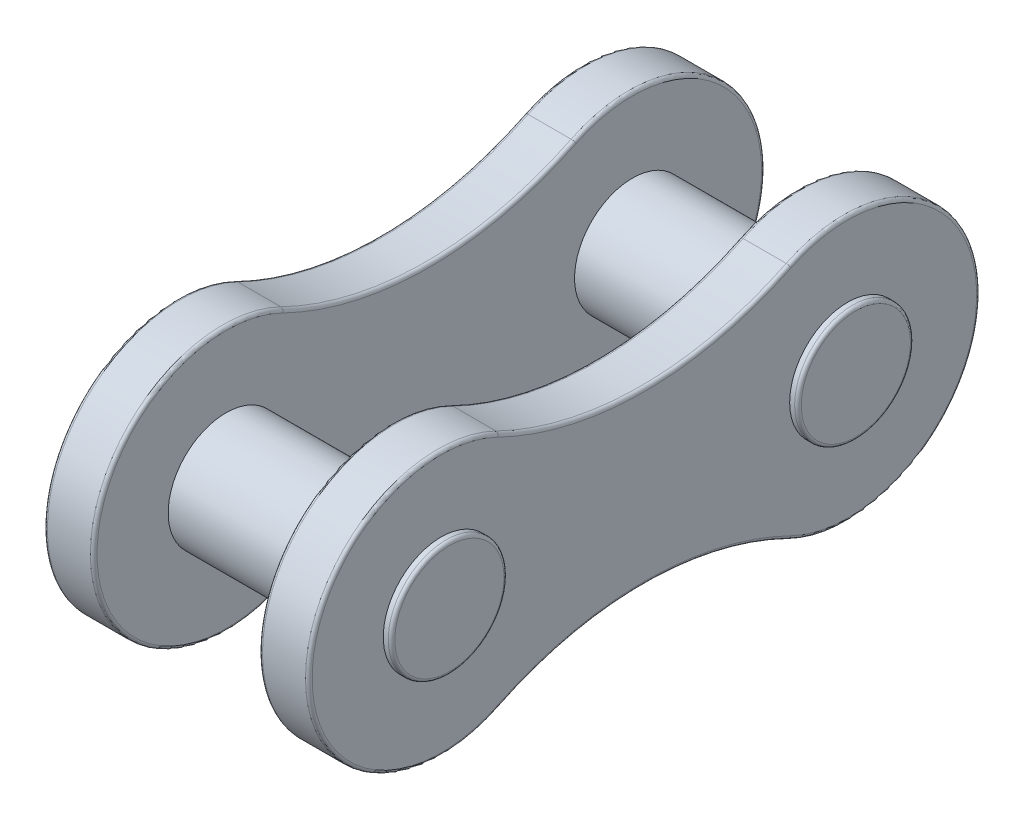
ISO-10303-21;
HEADER;
FILE_DESCRIPTION(('STEP AP214'),'2;1');
FILE_NAME('part.step','',(''),(''),'','','');
FILE_SCHEMA(('AUTOMOTIVE_DESIGN { 1 0 10303 214 1 1 1 1 }'));
ENDSEC;
DATA;
#1=APPLICATION_CONTEXT('core data for automotive mechanical design processes');
#2=APPLICATION_PROTOCOL_DEFINITION('international standard','automotive_design',2000,#1);
#3=PRODUCT_CONTEXT('',#1,'mechanical');
#4=PRODUCT('Part','Part','',(#3));
#5=PRODUCT_RELATED_PRODUCT_CATEGORY('part','',(#4));
#6=PRODUCT_DEFINITION_FORMATION('','',#4);
#7=PRODUCT_DEFINITION_CONTEXT('part definition',#1,'design');
#8=PRODUCT_DEFINITION('design','',#6,#7);
#9=PRODUCT_DEFINITION_SHAPE('','',#8);
#10=(LENGTH_UNIT() NAMED_UNIT(*) SI_UNIT(.MILLI.,.METRE.));
#11=(NAMED_UNIT(*) PLANE_ANGLE_UNIT() SI_UNIT($,.RADIAN.));
#12=(NAMED_UNIT(*) SI_UNIT($,.STERADIAN.) SOLID_ANGLE_UNIT());
#13=UNCERTAINTY_MEASURE_WITH_UNIT(LENGTH_MEASURE(1.E-05),#10,'distance_accuracy_value','');
#14=(GEOMETRIC_REPRESENTATION_CONTEXT(3) GLOBAL_UNCERTAINTY_ASSIGNED_CONTEXT((#13)) GLOBAL_UNIT_ASSIGNED_CONTEXT((#10,
#11,#12)) REPRESENTATION_CONTEXT('',''));
#15=CARTESIAN_POINT('',(0.,0.,0.));
#16=DIRECTION('',(0.,0.,1.));
#17=DIRECTION('',(1.,0.,0.));
#18=AXIS2_PLACEMENT_3D('',#15,#16,#17);
#19=CARTESIAN_POINT('',(4.,6.29072041592681,-3.07031539888683));
#20=DIRECTION('',(1.,0.,0.));
#21=DIRECTION('',(0.,0.,-1.));
#22=AXIS2_PLACEMENT_3D('',#19,#20,#21);
#23=PLANE('',#22);
#24=CARTESIAN_POINT('',(4.,-12.5814408318536,0.));
#25=DIRECTION('',(1.,0.,0.));
#26=DIRECTION('',(0.,0.,-1.));
#27=AXIS2_PLACEMENT_3D('',#24,#25,#26);
#28=CIRCLE('',#27,10.1);
#29=CARTESIAN_POINT('',(4.,-3.50482994601637,4.43002650410814));
#30=VERTEX_POINT('',#29);
#31=CARTESIAN_POINT('',(4.,-3.50482994601637,-4.43002650410814));
#32=VERTEX_POINT('',#31);
#33=EDGE_CURVE('E58',#30,#32,#28,.F.);
#34=ORIENTED_EDGE('',*,*,#33,.T.);
#35=CARTESIAN_POINT('',(4.,0.,-6.14063079777366));
#36=DIRECTION('',(1.,0.,0.));
#37=DIRECTION('',(0.,0.,-1.));
#38=AXIS2_PLACEMENT_3D('',#35,#36,#37);
#39=CIRCLE('',#38,3.9);
#40=CARTESIAN_POINT('',(4.,3.50482994601637,-4.43002650410814));
#41=VERTEX_POINT('',#40);
#42=EDGE_CURVE('E246',#32,#41,#39,.T.);
#43=ORIENTED_EDGE('',*,*,#42,.T.);
#44=CARTESIAN_POINT('',(4.,12.5814408318536,0.));
#45=DIRECTION('',(1.,0.,0.));
#46=DIRECTION('',(0.,0.,-1.));
#47=AXIS2_PLACEMENT_3D('',#44,#45,#46);
#48=CIRCLE('',#47,10.1);
#49=CARTESIAN_POINT('',(4.,3.50482994601637,4.43002650410814));
#50=VERTEX_POINT('',#49);
#51=EDGE_CURVE('E242',#41,#50,#48,.F.);
#52=ORIENTED_EDGE('',*,*,#51,.T.);
#53=CARTESIAN_POINT('',(4.,0.,6.14063079777366));
#54=DIRECTION('',(1.,0.,0.));
#55=DIRECTION('',(0.,0.,-1.));
#56=AXIS2_PLACEMENT_3D('',#53,#54,#55);
#57=CIRCLE('',#56,3.9);
#58=EDGE_CURVE('E63',#50,#30,#57,.T.);
#59=ORIENTED_EDGE('',*,*,#58,.T.);
#60=EDGE_LOOP('',(#34,#43,#52,#59));
#61=FACE_BOUND('',#60,.T.);
#62=CARTESIAN_POINT('',(4.,0.,6.14063079777366));
#63=DIRECTION('',(1.,0.,0.));
#64=DIRECTION('',(0.,0.,-1.));
#65=AXIS2_PLACEMENT_3D('',#62,#63,#64);
#66=CIRCLE('',#65,1.75);
#67=CARTESIAN_POINT('',(4.,0.,4.39063079777366));
#68=VERTEX_POINT('',#67);
#69=EDGE_CURVE('E342',#68,#68,#66,.T.);
#70=ORIENTED_EDGE('',*,*,#69,.F.);
#71=EDGE_LOOP('',(#70));
#72=FACE_BOUND('',#71,.T.);
#73=CARTESIAN_POINT('',(4.,0.,-6.14063079777366));
#74=DIRECTION('',(1.,0.,0.));
#75=DIRECTION('',(0.,0.,1.));
#76=AXIS2_PLACEMENT_3D('',#73,#74,#75);
#77=CIRCLE('',#76,1.75);
#78=CARTESIAN_POINT('',(4.,0.,-4.39063079777366));
#79=VERTEX_POINT('',#78);
#80=EDGE_CURVE('E345',#79,#79,#77,.T.);
#81=ORIENTED_EDGE('',*,*,#80,.F.);
#82=EDGE_LOOP('',(#81));
#83=FACE_BOUND('',#82,.T.);
#84=ADVANCED_FACE('F41',(#61,#72,#83),#23,.T.);
#85=CARTESIAN_POINT('',(2.5,6.29072041592681,-3.07031539888683));
#86=DIRECTION('',(1.,0.,0.));
#87=DIRECTION('',(0.,0.,-1.));
#88=AXIS2_PLACEMENT_3D('',#85,#86,#87);
#89=PLANE('',#88);
#90=CARTESIAN_POINT('',(2.5,12.5814408318536,0.));
#91=DIRECTION('',(1.,0.,0.));
#92=DIRECTION('',(0.,0.,-1.));
#93=AXIS2_PLACEMENT_3D('',#90,#91,#92);
#94=CIRCLE('',#93,10.1);
#95=CARTESIAN_POINT('',(2.5,3.50482994601637,4.43002650410814));
#96=VERTEX_POINT('',#95);
#97=CARTESIAN_POINT('',(2.5,3.50482994601637,-4.43002650410814));
#98=VERTEX_POINT('',#97);
#99=EDGE_CURVE('E225',#96,#98,#94,.T.);
#100=ORIENTED_EDGE('',*,*,#99,.T.);
#101=CARTESIAN_POINT('',(2.5,0.,-6.14063079777366));
#102=DIRECTION('',(1.,0.,0.));
#103=DIRECTION('',(0.,0.,-1.));
#104=AXIS2_PLACEMENT_3D('',#101,#102,#103);
#105=CIRCLE('',#104,3.9);
#106=CARTESIAN_POINT('',(2.5,-3.50482994601637,-4.43002650410814));
#107=VERTEX_POINT('',#106);
#108=EDGE_CURVE('E231',#98,#107,#105,.F.);
#109=ORIENTED_EDGE('',*,*,#108,.T.);
#110=CARTESIAN_POINT('',(2.5,-12.5814408318536,0.));
#111=DIRECTION('',(1.,0.,0.));
#112=DIRECTION('',(0.,0.,-1.));
#113=AXIS2_PLACEMENT_3D('',#110,#111,#112);
#114=CIRCLE('',#113,10.1);
#115=CARTESIAN_POINT('',(2.5,-3.50482994601637,4.43002650410814));
#116=VERTEX_POINT('',#115);
#117=EDGE_CURVE('E229',#107,#116,#114,.T.);
#118=ORIENTED_EDGE('',*,*,#117,.T.);
#119=CARTESIAN_POINT('',(2.5,0.,6.14063079777366));
#120=DIRECTION('',(1.,0.,0.));
#121=DIRECTION('',(0.,0.,-1.));
#122=AXIS2_PLACEMENT_3D('',#119,#120,#121);
#123=CIRCLE('',#122,3.9);
#124=EDGE_CURVE('E227',#116,#96,#123,.F.);
#125=ORIENTED_EDGE('',*,*,#124,.T.);
#126=EDGE_LOOP('',(#100,#109,#118,#125));
#127=FACE_BOUND('',#126,.T.);
#128=CARTESIAN_POINT('',(2.5,0.,6.14063079777366));
#129=DIRECTION('',(1.,0.,0.));
#130=DIRECTION('',(0.,0.,-1.));
#131=AXIS2_PLACEMENT_3D('',#128,#129,#130);
#132=CIRCLE('',#131,1.75);
#133=CARTESIAN_POINT('',(2.5,0.,4.39063079777366));
#134=VERTEX_POINT('',#133);
#135=EDGE_CURVE('E362',#134,#134,#132,.F.);
#136=ORIENTED_EDGE('',*,*,#135,.F.);
#137=EDGE_LOOP('',(#136));
#138=FACE_BOUND('',#137,.T.);
#139=CARTESIAN_POINT('',(2.5,0.,-6.14063079777366));
#140=DIRECTION('',(1.,0.,0.));
#141=DIRECTION('',(0.,0.,-1.));
#142=AXIS2_PLACEMENT_3D('',#139,#140,#141);
#143=CIRCLE('',#142,1.75);
#144=CARTESIAN_POINT('',(2.5,0.,-7.89063079777365));
#145=VERTEX_POINT('',#144);
#146=EDGE_CURVE('E348',#145,#145,#143,.F.);
#147=ORIENTED_EDGE('',*,*,#146,.F.);
#148=EDGE_LOOP('',(#147));
#149=FACE_BOUND('',#148,.T.);
#150=ADVANCED_FACE('F405',(#127,#138,#149),#89,.F.);
#151=CARTESIAN_POINT('',(4.,12.5814408318536,0.));
#152=DIRECTION('',(-1.,0.,0.));
#153=DIRECTION('',(0.,0.,1.));
#154=AXIS2_PLACEMENT_3D('',#151,#152,#153);
#155=CYLINDRICAL_SURFACE('',#154,10.);
#156=DIRECTION('',(-1.,0.,0.));
#157=VECTOR('',#156,1.);
#158=CARTESIAN_POINT('',(4.,3.59469738052961,-4.38616485555261));
#159=LINE('',#158,#157);
#160=CARTESIAN_POINT('',(3.9,3.59469738052961,-4.38616485555261));
#161=VERTEX_POINT('',#160);
#162=CARTESIAN_POINT('',(2.6,3.59469738052961,-4.38616485555261));
#163=VERTEX_POINT('',#162);
#164=EDGE_CURVE('E340',#161,#163,#159,.T.);
#165=ORIENTED_EDGE('',*,*,#164,.T.);
#166=CARTESIAN_POINT('',(2.6,12.5814408318536,0.));
#167=DIRECTION('',(1.,0.,0.));
#168=DIRECTION('',(0.,0.,-1.));
#169=AXIS2_PLACEMENT_3D('',#166,#167,#168);
#170=CIRCLE('',#169,10.);
#171=CARTESIAN_POINT('',(2.6,3.59469738052961,4.38616485555261));
#172=VERTEX_POINT('',#171);
#173=EDGE_CURVE('E11',#163,#172,#170,.F.);
#174=ORIENTED_EDGE('',*,*,#173,.T.);
#175=DIRECTION('',(-1.,0.,0.));
#176=VECTOR('',#175,1.);
#177=CARTESIAN_POINT('',(4.,3.59469738052961,4.38616485555261));
#178=LINE('',#177,#176);
#179=CARTESIAN_POINT('',(3.9,3.59469738052961,4.38616485555261));
#180=VERTEX_POINT('',#179);
#181=EDGE_CURVE('E324',#180,#172,#178,.T.);
#182=ORIENTED_EDGE('',*,*,#181,.F.);
#183=CARTESIAN_POINT('',(3.9,12.5814408318536,0.));
#184=DIRECTION('',(1.,0.,0.));
#185=DIRECTION('',(0.,0.,-1.));
#186=AXIS2_PLACEMENT_3D('',#183,#184,#185);
#187=CIRCLE('',#186,10.);
#188=EDGE_CURVE('E50',#180,#161,#187,.T.);
#189=ORIENTED_EDGE('',*,*,#188,.T.);
#190=EDGE_LOOP('',(#165,#174,#182,#189));
#191=FACE_BOUND('',#190,.T.);
#192=ADVANCED_FACE('F330',(#191),#155,.F.);
#193=CARTESIAN_POINT('',(4.,0.,6.14063079777366));
#194=DIRECTION('',(-1.,0.,0.));
#195=DIRECTION('',(0.,0.,1.));
#196=AXIS2_PLACEMENT_3D('',#193,#194,#195);
#197=CYLINDRICAL_SURFACE('',#196,4.);
#198=ORIENTED_EDGE('',*,*,#181,.T.);
#199=CARTESIAN_POINT('',(2.6,0.,6.14063079777366));
#200=DIRECTION('',(1.,0.,0.));
#201=DIRECTION('',(0.,0.,-1.));
#202=AXIS2_PLACEMENT_3D('',#199,#200,#201);
#203=CIRCLE('',#202,4.);
#204=CARTESIAN_POINT('',(2.6,-3.59469738052961,4.38616485555261));
#205=VERTEX_POINT('',#204);
#206=EDGE_CURVE('E240',#172,#205,#203,.T.);
#207=ORIENTED_EDGE('',*,*,#206,.T.);
#208=DIRECTION('',(-1.,0.,0.));
#209=VECTOR('',#208,1.);
#210=CARTESIAN_POINT('',(4.,-3.59469738052961,4.38616485555261));
#211=LINE('',#210,#209);
#212=CARTESIAN_POINT('',(3.9,-3.59469738052961,4.38616485555261));
#213=VERTEX_POINT('',#212);
#214=EDGE_CURVE('E327',#213,#205,#211,.T.);
#215=ORIENTED_EDGE('',*,*,#214,.F.);
#216=CARTESIAN_POINT('',(3.9,0.,6.14063079777366));
#217=DIRECTION('',(1.,0.,0.));
#218=DIRECTION('',(0.,0.,-1.));
#219=AXIS2_PLACEMENT_3D('',#216,#217,#218);
#220=CIRCLE('',#219,4.);
#221=EDGE_CURVE('E238',#213,#180,#220,.F.);
#222=ORIENTED_EDGE('',*,*,#221,.T.);
#223=EDGE_LOOP('',(#198,#207,#215,#222));
#224=FACE_BOUND('',#223,.T.);
#225=ADVANCED_FACE('F323',(#224),#197,.T.);
#226=CARTESIAN_POINT('',(4.,-12.5814408318536,0.));
#227=DIRECTION('',(-1.,0.,0.));
#228=DIRECTION('',(0.,0.,1.));
#229=AXIS2_PLACEMENT_3D('',#226,#227,#228);
#230=CYLINDRICAL_SURFACE('',#229,10.);
#231=ORIENTED_EDGE('',*,*,#214,.T.);
#232=CARTESIAN_POINT('',(2.6,-12.5814408318536,0.));
#233=DIRECTION('',(1.,0.,0.));
#234=DIRECTION('',(0.,0.,-1.));
#235=AXIS2_PLACEMENT_3D('',#232,#233,#234);
#236=CIRCLE('',#235,10.);
#237=CARTESIAN_POINT('',(2.6,-3.59469738052961,-4.38616485555261));
#238=VERTEX_POINT('',#237);
#239=EDGE_CURVE('E236',#205,#238,#236,.F.);
#240=ORIENTED_EDGE('',*,*,#239,.T.);
#241=DIRECTION('',(-1.,0.,0.));
#242=VECTOR('',#241,1.);
#243=CARTESIAN_POINT('',(4.,-3.59469738052961,-4.38616485555261));
#244=LINE('',#243,#242);
#245=CARTESIAN_POINT('',(3.9,-3.59469738052961,-4.38616485555261));
#246=VERTEX_POINT('',#245);
#247=EDGE_CURVE('E335',#246,#238,#244,.T.);
#248=ORIENTED_EDGE('',*,*,#247,.F.);
#249=CARTESIAN_POINT('',(3.9,-12.5814408318536,0.));
#250=DIRECTION('',(1.,0.,0.));
#251=DIRECTION('',(0.,0.,-1.));
#252=AXIS2_PLACEMENT_3D('',#249,#250,#251);
#253=CIRCLE('',#252,10.);
#254=EDGE_CURVE('E234',#246,#213,#253,.T.);
#255=ORIENTED_EDGE('',*,*,#254,.T.);
#256=EDGE_LOOP('',(#231,#240,#248,#255));
#257=FACE_BOUND('',#256,.T.);
#258=ADVANCED_FACE('F415',(#257),#230,.F.);
#259=CARTESIAN_POINT('',(4.,0.,-6.14063079777366));
#260=DIRECTION('',(-1.,0.,0.));
#261=DIRECTION('',(0.,0.,1.));
#262=AXIS2_PLACEMENT_3D('',#259,#260,#261);
#263=CYLINDRICAL_SURFACE('',#262,4.);
#264=ORIENTED_EDGE('',*,*,#247,.T.);
#265=CARTESIAN_POINT('',(2.6,0.,-6.14063079777366));
#266=DIRECTION('',(1.,0.,0.));
#267=DIRECTION('',(0.,0.,-1.));
#268=AXIS2_PLACEMENT_3D('',#265,#266,#267);
#269=CIRCLE('',#268,4.);
#270=EDGE_CURVE('E222',#238,#163,#269,.T.);
#271=ORIENTED_EDGE('',*,*,#270,.T.);
#272=ORIENTED_EDGE('',*,*,#164,.F.);
#273=CARTESIAN_POINT('',(3.9,0.,-6.14063079777366));
#274=DIRECTION('',(1.,0.,0.));
#275=DIRECTION('',(0.,0.,-1.));
#276=AXIS2_PLACEMENT_3D('',#273,#274,#275);
#277=CIRCLE('',#276,4.);
#278=EDGE_CURVE('E219',#161,#246,#277,.F.);
#279=ORIENTED_EDGE('',*,*,#278,.T.);
#280=EDGE_LOOP('',(#264,#271,#272,#279));
#281=FACE_BOUND('',#280,.T.);
#282=ADVANCED_FACE('F399',(#281),#263,.T.);
#283=CARTESIAN_POINT('',(4.25,0.,-6.14063079777366));
#284=DIRECTION('',(-1.,0.,0.));
#285=DIRECTION('',(0.,0.,1.));
#286=AXIS2_PLACEMENT_3D('',#283,#284,#285);
#287=CYLINDRICAL_SURFACE('',#286,1.75);
#288=CARTESIAN_POINT('',(-2.5,0.,-6.14063079777366));
#289=DIRECTION('',(1.,0.,0.));
#290=DIRECTION('',(0.,0.,-1.));
#291=AXIS2_PLACEMENT_3D('',#288,#289,#290);
#292=CIRCLE('',#291,1.75);
#293=CARTESIAN_POINT('',(-2.5,0.,-7.89063079777365));
#294=VERTEX_POINT('',#293);
#295=EDGE_CURVE('E352',#294,#294,#292,.T.);
#296=ORIENTED_EDGE('',*,*,#295,.T.);
#297=EDGE_LOOP('',(#296));
#298=FACE_BOUND('',#297,.T.);
#299=ORIENTED_EDGE('',*,*,#146,.T.);
#300=EDGE_LOOP('',(#299));
#301=FACE_BOUND('',#300,.T.);
#302=ADVANCED_FACE('F384',(#298,#301),#287,.T.);
#303=CARTESIAN_POINT('',(4.15,0.,-6.14063079777366));
#304=DIRECTION('',(1.,0.,0.));
#305=DIRECTION('',(0.,0.,-1.));
#306=AXIS2_PLACEMENT_3D('',#303,#304,#305);
#307=CIRCLE('',#306,1.75);
#308=CARTESIAN_POINT('',(4.15,0.,-7.89063079777365));
#309=VERTEX_POINT('',#308);
#310=EDGE_CURVE('E263',#309,#309,#307,.F.);
#311=ORIENTED_EDGE('',*,*,#310,.T.);
#312=EDGE_LOOP('',(#311));
#313=FACE_BOUND('',#312,.T.);
#314=ORIENTED_EDGE('',*,*,#80,.T.);
#315=EDGE_LOOP('',(#314));
#316=FACE_BOUND('',#315,.T.);
#317=ADVANCED_FACE('F385',(#313,#316),#287,.T.);
#318=CARTESIAN_POINT('',(4.25,0.,-6.14063079777366));
#319=DIRECTION('',(1.,0.,0.));
#320=DIRECTION('',(0.,0.,-1.));
#321=AXIS2_PLACEMENT_3D('',#318,#319,#320);
#322=PLANE('',#321);
#323=CARTESIAN_POINT('',(4.25,0.,-6.14063079777366));
#324=DIRECTION('',(1.,0.,0.));
#325=DIRECTION('',(0.,0.,-1.));
#326=AXIS2_PLACEMENT_3D('',#323,#324,#325);
#327=CIRCLE('',#326,1.65);
#328=CARTESIAN_POINT('',(4.25,0.,-7.79063079777366));
#329=VERTEX_POINT('',#328);
#330=EDGE_CURVE('E260',#329,#329,#327,.T.);
#331=ORIENTED_EDGE('',*,*,#330,.T.);
#332=EDGE_LOOP('',(#331));
#333=FACE_BOUND('',#332,.T.);
#334=ADVANCED_FACE('F402',(#333),#322,.T.);
#335=CARTESIAN_POINT('',(-4.,0.,6.14063079777366));
#336=DIRECTION('',(1.,0.,0.));
#337=DIRECTION('',(0.,0.,-1.));
#338=AXIS2_PLACEMENT_3D('',#335,#336,#337);
#339=CYLINDRICAL_SURFACE('',#338,4.);
#340=DIRECTION('',(1.,0.,0.));
#341=VECTOR('',#340,1.);
#342=CARTESIAN_POINT('',(-4.,3.59469738052961,4.38616485555261));
#343=LINE('',#342,#341);
#344=CARTESIAN_POINT('',(-3.9,3.59469738052961,4.38616485555261));
#345=VERTEX_POINT('',#344);
#346=CARTESIAN_POINT('',(-2.6,3.59469738052961,4.38616485555261));
#347=VERTEX_POINT('',#346);
#348=EDGE_CURVE('E351',#345,#347,#343,.T.);
#349=ORIENTED_EDGE('',*,*,#348,.F.);
#350=CARTESIAN_POINT('',(-3.9,0.,6.14063079777366));
#351=DIRECTION('',(1.,0.,0.));
#352=DIRECTION('',(0.,0.,-1.));
#353=AXIS2_PLACEMENT_3D('',#350,#351,#352);
#354=CIRCLE('',#353,4.);
#355=CARTESIAN_POINT('',(-3.9,-3.59469738052961,4.38616485555261));
#356=VERTEX_POINT('',#355);
#357=EDGE_CURVE('E208',#345,#356,#354,.T.);
#358=ORIENTED_EDGE('',*,*,#357,.T.);
#359=DIRECTION('',(1.,0.,0.));
#360=VECTOR('',#359,1.);
#361=CARTESIAN_POINT('',(-4.,-3.59469738052961,4.38616485555261));
#362=LINE('',#361,#360);
#363=CARTESIAN_POINT('',(-2.6,-3.59469738052961,4.38616485555261));
#364=VERTEX_POINT('',#363);
#365=EDGE_CURVE('E161',#356,#364,#362,.T.);
#366=ORIENTED_EDGE('',*,*,#365,.T.);
#367=CARTESIAN_POINT('',(-2.6,0.,6.14063079777366));
#368=DIRECTION('',(1.,0.,0.));
#369=DIRECTION('',(0.,0.,-1.));
#370=AXIS2_PLACEMENT_3D('',#367,#368,#369);
#371=CIRCLE('',#370,4.);
#372=EDGE_CURVE('E166',#364,#347,#371,.F.);
#373=ORIENTED_EDGE('',*,*,#372,.T.);
#374=EDGE_LOOP('',(#349,#358,#366,#373));
#375=FACE_BOUND('',#374,.T.);
#376=ADVANCED_FACE('F499',(#375),#339,.T.);
#377=CARTESIAN_POINT('',(-4.,12.5814408318536,0.));
#378=DIRECTION('',(1.,0.,0.));
#379=DIRECTION('',(0.,0.,-1.));
#380=AXIS2_PLACEMENT_3D('',#377,#378,#379);
#381=CYLINDRICAL_SURFACE('',#380,10.);
#382=DIRECTION('',(1.,0.,0.));
#383=VECTOR('',#382,1.);
#384=CARTESIAN_POINT('',(-4.,3.5946973805296,-4.3861648555526));
#385=LINE('',#384,#383);
#386=CARTESIAN_POINT('',(-3.9,3.5946973805296,-4.3861648555526));
#387=VERTEX_POINT('',#386);
#388=CARTESIAN_POINT('',(-2.6,3.5946973805296,-4.3861648555526));
#389=VERTEX_POINT('',#388);
#390=EDGE_CURVE('E179',#387,#389,#385,.T.);
#391=ORIENTED_EDGE('',*,*,#390,.F.);
#392=CARTESIAN_POINT('',(-3.9,12.5814408318536,0.));
#393=DIRECTION('',(1.,0.,0.));
#394=DIRECTION('',(0.,0.,-1.));
#395=AXIS2_PLACEMENT_3D('',#392,#393,#394);
#396=CIRCLE('',#395,10.);
#397=EDGE_CURVE('E274',#387,#345,#396,.F.);
#398=ORIENTED_EDGE('',*,*,#397,.T.);
#399=ORIENTED_EDGE('',*,*,#348,.T.);
#400=CARTESIAN_POINT('',(-2.6,12.5814408318536,0.));
#401=DIRECTION('',(1.,0.,0.));
#402=DIRECTION('',(0.,0.,-1.));
#403=AXIS2_PLACEMENT_3D('',#400,#401,#402);
#404=CIRCLE('',#403,10.);
#405=EDGE_CURVE('E272',#347,#389,#404,.T.);
#406=ORIENTED_EDGE('',*,*,#405,.T.);
#407=EDGE_LOOP('',(#391,#398,#399,#406));
#408=FACE_BOUND('',#407,.T.);
#409=ADVANCED_FACE('F504',(#408),#381,.F.);
#410=CARTESIAN_POINT('',(-4.,0.,-6.14063079777366));
#411=DIRECTION('',(1.,0.,0.));
#412=DIRECTION('',(0.,0.,-1.));
#413=AXIS2_PLACEMENT_3D('',#410,#411,#412);
#414=CYLINDRICAL_SURFACE('',#413,4.);
#415=DIRECTION('',(1.,0.,0.));
#416=VECTOR('',#415,1.);
#417=CARTESIAN_POINT('',(-4.,-3.59469738052961,-4.38616485555261));
#418=LINE('',#417,#416);
#419=CARTESIAN_POINT('',(-3.9,-3.59469738052961,-4.38616485555261));
#420=VERTEX_POINT('',#419);
#421=CARTESIAN_POINT('',(-2.6,-3.59469738052961,-4.38616485555261));
#422=VERTEX_POINT('',#421);
#423=EDGE_CURVE('E159',#420,#422,#418,.T.);
#424=ORIENTED_EDGE('',*,*,#423,.F.);
#425=CARTESIAN_POINT('',(-3.9,0.,-6.14063079777366));
#426=DIRECTION('',(1.,0.,0.));
#427=DIRECTION('',(0.,0.,-1.));
#428=AXIS2_PLACEMENT_3D('',#425,#426,#427);
#429=CIRCLE('',#428,4.);
#430=EDGE_CURVE('E175',#420,#387,#429,.T.);
#431=ORIENTED_EDGE('',*,*,#430,.T.);
#432=ORIENTED_EDGE('',*,*,#390,.T.);
#433=CARTESIAN_POINT('',(-2.6,0.,-6.14063079777366));
#434=DIRECTION('',(1.,0.,0.));
#435=DIRECTION('',(0.,0.,-1.));
#436=AXIS2_PLACEMENT_3D('',#433,#434,#435);
#437=CIRCLE('',#436,4.);
#438=EDGE_CURVE('E178',#389,#422,#437,.F.);
#439=ORIENTED_EDGE('',*,*,#438,.T.);
#440=EDGE_LOOP('',(#424,#431,#432,#439));
#441=FACE_BOUND('',#440,.T.);
#442=ADVANCED_FACE('F172',(#441),#414,.T.);
#443=CARTESIAN_POINT('',(-4.,-12.5814408318536,0.));
#444=DIRECTION('',(1.,0.,0.));
#445=DIRECTION('',(0.,0.,-1.));
#446=AXIS2_PLACEMENT_3D('',#443,#444,#445);
#447=CYLINDRICAL_SURFACE('',#446,10.);
#448=ORIENTED_EDGE('',*,*,#365,.F.);
#449=CARTESIAN_POINT('',(-3.9,-12.5814408318536,0.));
#450=DIRECTION('',(1.,0.,0.));
#451=DIRECTION('',(0.,0.,-1.));
#452=AXIS2_PLACEMENT_3D('',#449,#450,#451);
#453=CIRCLE('',#452,10.);
#454=EDGE_CURVE('E156',#356,#420,#453,.F.);
#455=ORIENTED_EDGE('',*,*,#454,.T.);
#456=ORIENTED_EDGE('',*,*,#423,.T.);
#457=CARTESIAN_POINT('',(-2.6,-12.5814408318536,0.));
#458=DIRECTION('',(1.,0.,0.));
#459=DIRECTION('',(0.,0.,-1.));
#460=AXIS2_PLACEMENT_3D('',#457,#458,#459);
#461=CIRCLE('',#460,10.);
#462=EDGE_CURVE('E167',#422,#364,#461,.T.);
#463=ORIENTED_EDGE('',*,*,#462,.T.);
#464=EDGE_LOOP('',(#448,#455,#456,#463));
#465=FACE_BOUND('',#464,.T.);
#466=ADVANCED_FACE('F158',(#465),#447,.F.);
#467=CARTESIAN_POINT('',(-4.,-6.29072041592681,3.07031539888683));
#468=DIRECTION('',(1.,0.,0.));
#469=DIRECTION('',(0.,0.,-1.));
#470=AXIS2_PLACEMENT_3D('',#467,#468,#469);
#471=PLANE('',#470);
#472=CARTESIAN_POINT('',(-4.,12.5814408318536,0.));
#473=DIRECTION('',(1.,0.,0.));
#474=DIRECTION('',(0.,0.,-1.));
#475=AXIS2_PLACEMENT_3D('',#472,#473,#474);
#476=CIRCLE('',#475,10.1);
#477=CARTESIAN_POINT('',(-4.,3.50482994601637,4.43002650410813));
#478=VERTEX_POINT('',#477);
#479=CARTESIAN_POINT('',(-4.,3.50482994601636,-4.43002650410813));
#480=VERTEX_POINT('',#479);
#481=EDGE_CURVE('E194',#478,#480,#476,.T.);
#482=ORIENTED_EDGE('',*,*,#481,.T.);
#483=CARTESIAN_POINT('',(-4.,0.,-6.14063079777366));
#484=DIRECTION('',(1.,0.,0.));
#485=DIRECTION('',(0.,0.,-1.));
#486=AXIS2_PLACEMENT_3D('',#483,#484,#485);
#487=CIRCLE('',#486,3.9);
#488=CARTESIAN_POINT('',(-4.,-3.50482994601637,-4.43002650410814));
#489=VERTEX_POINT('',#488);
#490=EDGE_CURVE('E204',#480,#489,#487,.F.);
#491=ORIENTED_EDGE('',*,*,#490,.T.);
#492=CARTESIAN_POINT('',(-4.,-12.5814408318536,0.));
#493=DIRECTION('',(1.,0.,0.));
#494=DIRECTION('',(0.,0.,-1.));
#495=AXIS2_PLACEMENT_3D('',#492,#493,#494);
#496=CIRCLE('',#495,10.1);
#497=CARTESIAN_POINT('',(-4.,-3.50482994601637,4.43002650410814));
#498=VERTEX_POINT('',#497);
#499=EDGE_CURVE('E184',#489,#498,#496,.T.);
#500=ORIENTED_EDGE('',*,*,#499,.T.);
#501=CARTESIAN_POINT('',(-4.,0.,6.14063079777366));
#502=DIRECTION('',(1.,0.,0.));
#503=DIRECTION('',(0.,0.,-1.));
#504=AXIS2_PLACEMENT_3D('',#501,#502,#503);
#505=CIRCLE('',#504,3.9);
#506=EDGE_CURVE('E196',#498,#478,#505,.F.);
#507=ORIENTED_EDGE('',*,*,#506,.T.);
#508=EDGE_LOOP('',(#482,#491,#500,#507));
#509=FACE_BOUND('',#508,.T.);
#510=CARTESIAN_POINT('',(-4.,0.,6.14063079777366));
#511=DIRECTION('',(1.,0.,0.));
#512=DIRECTION('',(0.,0.,-1.));
#513=AXIS2_PLACEMENT_3D('',#510,#511,#512);
#514=CIRCLE('',#513,1.75);
#515=CARTESIAN_POINT('',(-4.,0.,4.39063079777366));
#516=VERTEX_POINT('',#515);
#517=EDGE_CURVE('E283',#516,#516,#514,.F.);
#518=ORIENTED_EDGE('',*,*,#517,.F.);
#519=EDGE_LOOP('',(#518));
#520=FACE_BOUND('',#519,.T.);
#521=CARTESIAN_POINT('',(-4.,0.,-6.14063079777366));
#522=DIRECTION('',(1.,0.,0.));
#523=DIRECTION('',(0.,0.,-1.));
#524=AXIS2_PLACEMENT_3D('',#521,#522,#523);
#525=CIRCLE('',#524,1.75);
#526=CARTESIAN_POINT('',(-4.,0.,-7.89063079777365));
#527=VERTEX_POINT('',#526);
#528=EDGE_CURVE('E198',#527,#527,#525,.T.);
#529=ORIENTED_EDGE('',*,*,#528,.T.);
#530=EDGE_LOOP('',(#529));
#531=FACE_BOUND('',#530,.T.);
#532=ADVANCED_FACE('F370',(#509,#520,#531),#471,.F.);
#533=CARTESIAN_POINT('',(-2.5,-6.29072041592681,3.07031539888683));
#534=DIRECTION('',(1.,0.,0.));
#535=DIRECTION('',(0.,0.,-1.));
#536=AXIS2_PLACEMENT_3D('',#533,#534,#535);
#537=PLANE('',#536);
#538=CARTESIAN_POINT('',(-2.5,-12.5814408318536,0.));
#539=DIRECTION('',(1.,0.,0.));
#540=DIRECTION('',(0.,0.,-1.));
#541=AXIS2_PLACEMENT_3D('',#538,#539,#540);
#542=CIRCLE('',#541,10.1);
#543=CARTESIAN_POINT('',(-2.5,-3.50482994601637,4.43002650410814));
#544=VERTEX_POINT('',#543);
#545=CARTESIAN_POINT('',(-2.5,-3.50482994601637,-4.43002650410814));
#546=VERTEX_POINT('',#545);
#547=EDGE_CURVE('E214',#544,#546,#542,.F.);
#548=ORIENTED_EDGE('',*,*,#547,.T.);
#549=CARTESIAN_POINT('',(-2.5,0.,-6.14063079777366));
#550=DIRECTION('',(1.,0.,0.));
#551=DIRECTION('',(0.,0.,-1.));
#552=AXIS2_PLACEMENT_3D('',#549,#550,#551);
#553=CIRCLE('',#552,3.9);
#554=CARTESIAN_POINT('',(-2.5,3.50482994601636,-4.43002650410813));
#555=VERTEX_POINT('',#554);
#556=EDGE_CURVE('E216',#546,#555,#553,.T.);
#557=ORIENTED_EDGE('',*,*,#556,.T.);
#558=CARTESIAN_POINT('',(-2.5,12.5814408318536,0.));
#559=DIRECTION('',(1.,0.,0.));
#560=DIRECTION('',(0.,0.,-1.));
#561=AXIS2_PLACEMENT_3D('',#558,#559,#560);
#562=CIRCLE('',#561,10.1);
#563=CARTESIAN_POINT('',(-2.5,3.50482994601637,4.43002650410813));
#564=VERTEX_POINT('',#563);
#565=EDGE_CURVE('E210',#555,#564,#562,.F.);
#566=ORIENTED_EDGE('',*,*,#565,.T.);
#567=CARTESIAN_POINT('',(-2.5,0.,6.14063079777366));
#568=DIRECTION('',(1.,0.,0.));
#569=DIRECTION('',(0.,0.,-1.));
#570=AXIS2_PLACEMENT_3D('',#567,#568,#569);
#571=CIRCLE('',#570,3.9);
#572=EDGE_CURVE('E212',#564,#544,#571,.T.);
#573=ORIENTED_EDGE('',*,*,#572,.T.);
#574=EDGE_LOOP('',(#548,#557,#566,#573));
#575=FACE_BOUND('',#574,.T.);
#576=CARTESIAN_POINT('',(-2.5,0.,6.14063079777366));
#577=DIRECTION('',(1.,0.,0.));
#578=DIRECTION('',(0.,0.,-1.));
#579=AXIS2_PLACEMENT_3D('',#576,#577,#578);
#580=CIRCLE('',#579,1.75);
#581=CARTESIAN_POINT('',(-2.5,0.,4.39063079777366));
#582=VERTEX_POINT('',#581);
#583=EDGE_CURVE('E359',#582,#582,#580,.T.);
#584=ORIENTED_EDGE('',*,*,#583,.F.);
#585=EDGE_LOOP('',(#584));
#586=FACE_BOUND('',#585,.T.);
#587=ORIENTED_EDGE('',*,*,#295,.F.);
#588=EDGE_LOOP('',(#587));
#589=FACE_BOUND('',#588,.T.);
#590=ADVANCED_FACE('F373',(#575,#586,#589),#537,.T.);
#591=CARTESIAN_POINT('',(-4.25,0.,-6.14063079777366));
#592=DIRECTION('',(1.,0.,0.));
#593=DIRECTION('',(0.,0.,-1.));
#594=AXIS2_PLACEMENT_3D('',#591,#592,#593);
#595=PLANE('',#594);
#596=CARTESIAN_POINT('',(-4.25,0.,-6.14063079777366));
#597=DIRECTION('',(1.,0.,0.));
#598=DIRECTION('',(0.,0.,-1.));
#599=AXIS2_PLACEMENT_3D('',#596,#597,#598);
#600=CIRCLE('',#599,1.65);
#601=CARTESIAN_POINT('',(-4.25,0.,-7.79063079777366));
#602=VERTEX_POINT('',#601);
#603=EDGE_CURVE('E251',#602,#602,#600,.F.);
#604=ORIENTED_EDGE('',*,*,#603,.T.);
#605=EDGE_LOOP('',(#604));
#606=FACE_BOUND('',#605,.T.);
#607=ADVANCED_FACE('F381',(#606),#595,.F.);
#608=CARTESIAN_POINT('',(-4.15,0.,-6.14063079777366));
#609=DIRECTION('',(1.,0.,0.));
#610=DIRECTION('',(0.,0.,-1.));
#611=AXIS2_PLACEMENT_3D('',#608,#609,#610);
#612=CIRCLE('',#611,1.75);
#613=CARTESIAN_POINT('',(-4.15,0.,-7.89063079777365));
#614=VERTEX_POINT('',#613);
#615=EDGE_CURVE('E248',#614,#614,#612,.T.);
#616=ORIENTED_EDGE('',*,*,#615,.T.);
#617=EDGE_LOOP('',(#616));
#618=FACE_BOUND('',#617,.T.);
#619=ORIENTED_EDGE('',*,*,#528,.F.);
#620=EDGE_LOOP('',(#619));
#621=FACE_BOUND('',#620,.T.);
#622=ADVANCED_FACE('F378',(#618,#621),#287,.T.);
#623=CARTESIAN_POINT('',(4.25,0.,6.14063079777366));
#624=DIRECTION('',(-1.,0.,0.));
#625=DIRECTION('',(0.,0.,1.));
#626=AXIS2_PLACEMENT_3D('',#623,#624,#625);
#627=CYLINDRICAL_SURFACE('',#626,1.75);
#628=ORIENTED_EDGE('',*,*,#583,.T.);
#629=EDGE_LOOP('',(#628));
#630=FACE_BOUND('',#629,.T.);
#631=ORIENTED_EDGE('',*,*,#135,.T.);
#632=EDGE_LOOP('',(#631));
#633=FACE_BOUND('',#632,.T.);
#634=ADVANCED_FACE('F380',(#630,#633),#627,.T.);
#635=CARTESIAN_POINT('',(-4.25,0.,6.14063079777366));
#636=DIRECTION('',(1.,0.,0.));
#637=DIRECTION('',(0.,0.,-1.));
#638=AXIS2_PLACEMENT_3D('',#635,#636,#637);
#639=PLANE('',#638);
#640=CARTESIAN_POINT('',(-4.25,0.,6.14063079777366));
#641=DIRECTION('',(1.,0.,0.));
#642=DIRECTION('',(0.,0.,-1.));
#643=AXIS2_PLACEMENT_3D('',#640,#641,#642);
#644=CIRCLE('',#643,1.65);
#645=CARTESIAN_POINT('',(-4.25,0.,4.49063079777366));
#646=VERTEX_POINT('',#645);
#647=EDGE_CURVE('E257',#646,#646,#644,.F.);
#648=ORIENTED_EDGE('',*,*,#647,.T.);
#649=EDGE_LOOP('',(#648));
#650=FACE_BOUND('',#649,.T.);
#651=ADVANCED_FACE('F391',(#650),#639,.F.);
#652=CARTESIAN_POINT('',(-4.15,0.,6.14063079777366));
#653=DIRECTION('',(1.,0.,0.));
#654=DIRECTION('',(0.,0.,-1.));
#655=AXIS2_PLACEMENT_3D('',#652,#653,#654);
#656=CIRCLE('',#655,1.75);
#657=CARTESIAN_POINT('',(-4.15,0.,4.39063079777366));
#658=VERTEX_POINT('',#657);
#659=EDGE_CURVE('E254',#658,#658,#656,.T.);
#660=ORIENTED_EDGE('',*,*,#659,.T.);
#661=EDGE_LOOP('',(#660));
#662=FACE_BOUND('',#661,.T.);
#663=ORIENTED_EDGE('',*,*,#517,.T.);
#664=EDGE_LOOP('',(#663));
#665=FACE_BOUND('',#664,.T.);
#666=ADVANCED_FACE('F368',(#662,#665),#627,.T.);
#667=CARTESIAN_POINT('',(4.15,0.,6.14063079777366));
#668=DIRECTION('',(1.,0.,0.));
#669=DIRECTION('',(0.,0.,-1.));
#670=AXIS2_PLACEMENT_3D('',#667,#668,#669);
#671=CIRCLE('',#670,1.75);
#672=CARTESIAN_POINT('',(4.15,0.,4.39063079777366));
#673=VERTEX_POINT('',#672);
#674=EDGE_CURVE('E269',#673,#673,#671,.F.);
#675=ORIENTED_EDGE('',*,*,#674,.T.);
#676=EDGE_LOOP('',(#675));
#677=FACE_BOUND('',#676,.T.);
#678=ORIENTED_EDGE('',*,*,#69,.T.);
#679=EDGE_LOOP('',(#678));
#680=FACE_BOUND('',#679,.T.);
#681=ADVANCED_FACE('F394',(#677,#680),#627,.T.);
#682=CARTESIAN_POINT('',(4.25,0.,6.14063079777366));
#683=DIRECTION('',(1.,0.,0.));
#684=DIRECTION('',(0.,0.,-1.));
#685=AXIS2_PLACEMENT_3D('',#682,#683,#684);
#686=PLANE('',#685);
#687=CARTESIAN_POINT('',(4.25,0.,6.14063079777366));
#688=DIRECTION('',(1.,0.,0.));
#689=DIRECTION('',(0.,0.,-1.));
#690=AXIS2_PLACEMENT_3D('',#687,#688,#689);
#691=CIRCLE('',#690,1.65);
#692=CARTESIAN_POINT('',(4.25,0.,4.49063079777366));
#693=VERTEX_POINT('',#692);
#694=EDGE_CURVE('E266',#693,#693,#691,.T.);
#695=ORIENTED_EDGE('',*,*,#694,.T.);
#696=EDGE_LOOP('',(#695));
#697=FACE_BOUND('',#696,.T.);
#698=ADVANCED_FACE('F436',(#697),#686,.T.);
#699=CARTESIAN_POINT('',(-3.9,0.,6.14063079777366));
#700=DIRECTION('',(1.,0.,0.));
#701=DIRECTION('',(0.,0.,-1.));
#702=AXIS2_PLACEMENT_3D('',#699,#700,#701);
#703=TOROIDAL_SURFACE('',#702,3.9,0.1);
#704=CARTESIAN_POINT('',(-3.9,3.50482994601637,4.43002650410813));
#705=DIRECTION('',(0.,-0.438616485555262,-0.898674345132401));
#706=DIRECTION('',(0.,0.898674345132401,-0.438616485555262));
#707=AXIS2_PLACEMENT_3D('',#704,#705,#706);
#708=CIRCLE('',#707,0.1);
#709=EDGE_CURVE('E188',#478,#345,#708,.T.);
#710=ORIENTED_EDGE('',*,*,#709,.F.);
#711=ORIENTED_EDGE('',*,*,#506,.F.);
#712=CARTESIAN_POINT('',(-3.9,-3.50482994601637,4.43002650410814));
#713=DIRECTION('',(0.,0.438616485555262,-0.898674345132401));
#714=DIRECTION('',(0.,0.898674345132401,0.438616485555262));
#715=AXIS2_PLACEMENT_3D('',#712,#713,#714);
#716=CIRCLE('',#715,0.1);
#717=EDGE_CURVE('E281',#356,#498,#716,.T.);
#718=ORIENTED_EDGE('',*,*,#717,.F.);
#719=ORIENTED_EDGE('',*,*,#357,.F.);
#720=EDGE_LOOP('',(#710,#711,#718,#719));
#721=FACE_BOUND('',#720,.T.);
#722=ADVANCED_FACE('F433',(#721),#703,.T.);
#723=CARTESIAN_POINT('',(-3.9,-12.5814408318536,0.));
#724=DIRECTION('',(1.,0.,0.));
#725=DIRECTION('',(0.,0.,-1.));
#726=AXIS2_PLACEMENT_3D('',#723,#724,#725);
#727=TOROIDAL_SURFACE('',#726,10.1,0.1);
#728=ORIENTED_EDGE('',*,*,#717,.T.);
#729=ORIENTED_EDGE('',*,*,#499,.F.);
#730=CARTESIAN_POINT('',(-3.9,-3.50482994601637,-4.43002650410814));
#731=DIRECTION('',(0.,-0.438616485555262,-0.898674345132401));
#732=DIRECTION('',(0.,0.898674345132401,-0.438616485555262));
#733=AXIS2_PLACEMENT_3D('',#730,#731,#732);
#734=CIRCLE('',#733,0.1);
#735=EDGE_CURVE('E182',#420,#489,#734,.T.);
#736=ORIENTED_EDGE('',*,*,#735,.F.);
#737=ORIENTED_EDGE('',*,*,#454,.F.);
#738=EDGE_LOOP('',(#728,#729,#736,#737));
#739=FACE_BOUND('',#738,.T.);
#740=ADVANCED_FACE('F183',(#739),#727,.T.);
#741=CARTESIAN_POINT('',(-3.9,12.5814408318536,0.));
#742=DIRECTION('',(1.,0.,0.));
#743=DIRECTION('',(0.,0.,-1.));
#744=AXIS2_PLACEMENT_3D('',#741,#742,#743);
#745=TOROIDAL_SURFACE('',#744,10.1,0.1);
#746=ORIENTED_EDGE('',*,*,#709,.T.);
#747=ORIENTED_EDGE('',*,*,#397,.F.);
#748=CARTESIAN_POINT('',(-3.9,3.50482994601636,-4.43002650410813));
#749=DIRECTION('',(0.,0.438616485555264,-0.8986743451324));
#750=DIRECTION('',(0.,0.898674345132401,0.438616485555264));
#751=AXIS2_PLACEMENT_3D('',#748,#749,#750);
#752=CIRCLE('',#751,0.1);
#753=EDGE_CURVE('E189',#480,#387,#752,.T.);
#754=ORIENTED_EDGE('',*,*,#753,.F.);
#755=ORIENTED_EDGE('',*,*,#481,.F.);
#756=EDGE_LOOP('',(#746,#747,#754,#755));
#757=FACE_BOUND('',#756,.T.);
#758=ADVANCED_FACE('F427',(#757),#745,.T.);
#759=CARTESIAN_POINT('',(-3.9,0.,-6.14063079777366));
#760=DIRECTION('',(1.,0.,0.));
#761=DIRECTION('',(0.,0.,-1.));
#762=AXIS2_PLACEMENT_3D('',#759,#760,#761);
#763=TOROIDAL_SURFACE('',#762,3.9,0.1);
#764=ORIENTED_EDGE('',*,*,#735,.T.);
#765=ORIENTED_EDGE('',*,*,#490,.F.);
#766=ORIENTED_EDGE('',*,*,#753,.T.);
#767=ORIENTED_EDGE('',*,*,#430,.F.);
#768=EDGE_LOOP('',(#764,#765,#766,#767));
#769=FACE_BOUND('',#768,.T.);
#770=ADVANCED_FACE('F191',(#769),#763,.T.);
#771=CARTESIAN_POINT('',(-2.6,0.,6.14063079777366));
#772=DIRECTION('',(1.,0.,0.));
#773=DIRECTION('',(0.,0.,-1.));
#774=AXIS2_PLACEMENT_3D('',#771,#772,#773);
#775=TOROIDAL_SURFACE('',#774,3.9,0.1);
#776=CARTESIAN_POINT('',(-2.6,3.50482994601637,4.43002650410813));
#777=DIRECTION('',(0.,-0.438616485555262,-0.898674345132401));
#778=DIRECTION('',(0.,0.898674345132401,-0.438616485555262));
#779=AXIS2_PLACEMENT_3D('',#776,#777,#778);
#780=CIRCLE('',#779,0.1);
#781=EDGE_CURVE('E289',#347,#564,#780,.T.);
#782=ORIENTED_EDGE('',*,*,#781,.F.);
#783=ORIENTED_EDGE('',*,*,#372,.F.);
#784=CARTESIAN_POINT('',(-2.6,-3.50482994601637,4.43002650410814));
#785=DIRECTION('',(0.,0.438616485555261,-0.898674345132402));
#786=DIRECTION('',(0.,0.898674345132402,0.438616485555261));
#787=AXIS2_PLACEMENT_3D('',#784,#785,#786);
#788=CIRCLE('',#787,0.1);
#789=EDGE_CURVE('E277',#544,#364,#788,.T.);
#790=ORIENTED_EDGE('',*,*,#789,.F.);
#791=ORIENTED_EDGE('',*,*,#572,.F.);
#792=EDGE_LOOP('',(#782,#783,#790,#791));
#793=FACE_BOUND('',#792,.T.);
#794=ADVANCED_FACE('F426',(#793),#775,.T.);
#795=CARTESIAN_POINT('',(-2.6,-12.5814408318536,0.));
#796=DIRECTION('',(1.,0.,0.));
#797=DIRECTION('',(0.,0.,-1.));
#798=AXIS2_PLACEMENT_3D('',#795,#796,#797);
#799=TOROIDAL_SURFACE('',#798,10.1,0.1);
#800=ORIENTED_EDGE('',*,*,#789,.T.);
#801=ORIENTED_EDGE('',*,*,#462,.F.);
#802=CARTESIAN_POINT('',(-2.6,-3.50482994601637,-4.43002650410814));
#803=DIRECTION('',(0.,-0.438616485555262,-0.898674345132401));
#804=DIRECTION('',(0.,0.898674345132401,-0.438616485555262));
#805=AXIS2_PLACEMENT_3D('',#802,#803,#804);
#806=CIRCLE('',#805,0.1);
#807=EDGE_CURVE('E286',#546,#422,#806,.T.);
#808=ORIENTED_EDGE('',*,*,#807,.F.);
#809=ORIENTED_EDGE('',*,*,#547,.F.);
#810=EDGE_LOOP('',(#800,#801,#808,#809));
#811=FACE_BOUND('',#810,.T.);
#812=ADVANCED_FACE('F446',(#811),#799,.T.);
#813=CARTESIAN_POINT('',(-2.6,12.5814408318536,0.));
#814=DIRECTION('',(1.,0.,0.));
#815=DIRECTION('',(0.,0.,-1.));
#816=AXIS2_PLACEMENT_3D('',#813,#814,#815);
#817=TOROIDAL_SURFACE('',#816,10.1,0.1);
#818=ORIENTED_EDGE('',*,*,#781,.T.);
#819=ORIENTED_EDGE('',*,*,#565,.F.);
#820=CARTESIAN_POINT('',(-2.6,3.50482994601636,-4.43002650410813));
#821=DIRECTION('',(0.,0.438616485555262,-0.898674345132401));
#822=DIRECTION('',(0.,0.898674345132401,0.438616485555262));
#823=AXIS2_PLACEMENT_3D('',#820,#821,#822);
#824=CIRCLE('',#823,0.1);
#825=EDGE_CURVE('E284',#389,#555,#824,.T.);
#826=ORIENTED_EDGE('',*,*,#825,.F.);
#827=ORIENTED_EDGE('',*,*,#405,.F.);
#828=EDGE_LOOP('',(#818,#819,#826,#827));
#829=FACE_BOUND('',#828,.T.);
#830=ADVANCED_FACE('F442',(#829),#817,.T.);
#831=CARTESIAN_POINT('',(-2.6,0.,-6.14063079777366));
#832=DIRECTION('',(1.,0.,0.));
#833=DIRECTION('',(0.,0.,-1.));
#834=AXIS2_PLACEMENT_3D('',#831,#832,#833);
#835=TOROIDAL_SURFACE('',#834,3.9,0.1);
#836=ORIENTED_EDGE('',*,*,#807,.T.);
#837=ORIENTED_EDGE('',*,*,#438,.F.);
#838=ORIENTED_EDGE('',*,*,#825,.T.);
#839=ORIENTED_EDGE('',*,*,#556,.F.);
#840=EDGE_LOOP('',(#836,#837,#838,#839));
#841=FACE_BOUND('',#840,.T.);
#842=ADVANCED_FACE('F438',(#841),#835,.T.);
#843=CARTESIAN_POINT('',(2.6,0.,6.14063079777366));
#844=DIRECTION('',(1.,0.,0.));
#845=DIRECTION('',(0.,0.,-1.));
#846=AXIS2_PLACEMENT_3D('',#843,#844,#845);
#847=TOROIDAL_SURFACE('',#846,3.9,0.1);
#848=CARTESIAN_POINT('',(2.6,3.50482994601637,4.43002650410814));
#849=DIRECTION('',(0.,-0.438616485555262,-0.898674345132401));
#850=DIRECTION('',(0.,0.898674345132401,-0.438616485555262));
#851=AXIS2_PLACEMENT_3D('',#848,#849,#850);
#852=CIRCLE('',#851,0.1);
#853=EDGE_CURVE('E298',#96,#172,#852,.T.);
#854=ORIENTED_EDGE('',*,*,#853,.F.);
#855=ORIENTED_EDGE('',*,*,#124,.F.);
#856=CARTESIAN_POINT('',(2.6,-3.50482994601637,4.43002650410814));
#857=DIRECTION('',(0.,0.438616485555262,-0.898674345132401));
#858=DIRECTION('',(0.,0.898674345132401,0.438616485555262));
#859=AXIS2_PLACEMENT_3D('',#856,#857,#858);
#860=CIRCLE('',#859,0.1);
#861=EDGE_CURVE('E287',#205,#116,#860,.T.);
#862=ORIENTED_EDGE('',*,*,#861,.F.);
#863=ORIENTED_EDGE('',*,*,#206,.F.);
#864=EDGE_LOOP('',(#854,#855,#862,#863));
#865=FACE_BOUND('',#864,.T.);
#866=ADVANCED_FACE('F441',(#865),#847,.T.);
#867=CARTESIAN_POINT('',(2.6,-12.5814408318536,0.));
#868=DIRECTION('',(1.,0.,0.));
#869=DIRECTION('',(0.,0.,-1.));
#870=AXIS2_PLACEMENT_3D('',#867,#868,#869);
#871=TOROIDAL_SURFACE('',#870,10.1,0.1);
#872=ORIENTED_EDGE('',*,*,#861,.T.);
#873=ORIENTED_EDGE('',*,*,#117,.F.);
#874=CARTESIAN_POINT('',(2.6,-3.50482994601637,-4.43002650410814));
#875=DIRECTION('',(0.,-0.438616485555262,-0.898674345132401));
#876=DIRECTION('',(0.,0.898674345132401,-0.438616485555262));
#877=AXIS2_PLACEMENT_3D('',#874,#875,#876);
#878=CIRCLE('',#877,0.1);
#879=EDGE_CURVE('E296',#238,#107,#878,.T.);
#880=ORIENTED_EDGE('',*,*,#879,.F.);
#881=ORIENTED_EDGE('',*,*,#239,.F.);
#882=EDGE_LOOP('',(#872,#873,#880,#881));
#883=FACE_BOUND('',#882,.T.);
#884=ADVANCED_FACE('F461',(#883),#871,.T.);
#885=CARTESIAN_POINT('',(2.6,12.5814408318536,0.));
#886=DIRECTION('',(1.,0.,0.));
#887=DIRECTION('',(0.,0.,-1.));
#888=AXIS2_PLACEMENT_3D('',#885,#886,#887);
#889=TOROIDAL_SURFACE('',#888,10.1,0.1);
#890=ORIENTED_EDGE('',*,*,#853,.T.);
#891=ORIENTED_EDGE('',*,*,#173,.F.);
#892=CARTESIAN_POINT('',(2.6,3.50482994601637,-4.43002650410814));
#893=DIRECTION('',(0.,0.438616485555262,-0.898674345132401));
#894=DIRECTION('',(0.,0.898674345132401,0.438616485555262));
#895=AXIS2_PLACEMENT_3D('',#892,#893,#894);
#896=CIRCLE('',#895,0.1);
#897=EDGE_CURVE('E294',#98,#163,#896,.T.);
#898=ORIENTED_EDGE('',*,*,#897,.F.);
#899=ORIENTED_EDGE('',*,*,#99,.F.);
#900=EDGE_LOOP('',(#890,#891,#898,#899));
#901=FACE_BOUND('',#900,.T.);
#902=ADVANCED_FACE('F457',(#901),#889,.T.);
#903=CARTESIAN_POINT('',(2.6,0.,-6.14063079777366));
#904=DIRECTION('',(1.,0.,0.));
#905=DIRECTION('',(0.,0.,-1.));
#906=AXIS2_PLACEMENT_3D('',#903,#904,#905);
#907=TOROIDAL_SURFACE('',#906,3.9,0.1);
#908=ORIENTED_EDGE('',*,*,#879,.T.);
#909=ORIENTED_EDGE('',*,*,#108,.F.);
#910=ORIENTED_EDGE('',*,*,#897,.T.);
#911=ORIENTED_EDGE('',*,*,#270,.F.);
#912=EDGE_LOOP('',(#908,#909,#910,#911));
#913=FACE_BOUND('',#912,.T.);
#914=ADVANCED_FACE('F454',(#913),#907,.T.);
#915=CARTESIAN_POINT('',(3.9,0.,6.14063079777366));
#916=DIRECTION('',(1.,0.,0.));
#917=DIRECTION('',(0.,0.,-1.));
#918=AXIS2_PLACEMENT_3D('',#915,#916,#917);
#919=TOROIDAL_SURFACE('',#918,3.9,0.1);
#920=CARTESIAN_POINT('',(3.9,3.50482994601637,4.43002650410814));
#921=DIRECTION('',(0.,-0.438616485555262,-0.898674345132401));
#922=DIRECTION('',(0.,0.898674345132401,-0.438616485555262));
#923=AXIS2_PLACEMENT_3D('',#920,#921,#922);
#924=CIRCLE('',#923,0.1);
#925=EDGE_CURVE('E306',#180,#50,#924,.T.);
#926=ORIENTED_EDGE('',*,*,#925,.F.);
#927=ORIENTED_EDGE('',*,*,#221,.F.);
#928=CARTESIAN_POINT('',(3.9,-3.50482994601637,4.43002650410814));
#929=DIRECTION('',(0.,0.438616485555262,-0.898674345132401));
#930=DIRECTION('',(0.,0.898674345132401,0.438616485555262));
#931=AXIS2_PLACEMENT_3D('',#928,#929,#930);
#932=CIRCLE('',#931,0.1);
#933=EDGE_CURVE('E45',#30,#213,#932,.T.);
#934=ORIENTED_EDGE('',*,*,#933,.F.);
#935=ORIENTED_EDGE('',*,*,#58,.F.);
#936=EDGE_LOOP('',(#926,#927,#934,#935));
#937=FACE_BOUND('',#936,.T.);
#938=ADVANCED_FACE('F318',(#937),#919,.T.);
#939=CARTESIAN_POINT('',(3.9,-12.5814408318536,0.));
#940=DIRECTION('',(1.,0.,0.));
#941=DIRECTION('',(0.,0.,-1.));
#942=AXIS2_PLACEMENT_3D('',#939,#940,#941);
#943=TOROIDAL_SURFACE('',#942,10.1,0.1);
#944=ORIENTED_EDGE('',*,*,#933,.T.);
#945=ORIENTED_EDGE('',*,*,#254,.F.);
#946=CARTESIAN_POINT('',(3.9,-3.50482994601637,-4.43002650410814));
#947=DIRECTION('',(0.,-0.438616485555262,-0.898674345132401));
#948=DIRECTION('',(0.,0.898674345132401,-0.438616485555262));
#949=AXIS2_PLACEMENT_3D('',#946,#947,#948);
#950=CIRCLE('',#949,0.1);
#951=EDGE_CURVE('E305',#32,#246,#950,.T.);
#952=ORIENTED_EDGE('',*,*,#951,.F.);
#953=ORIENTED_EDGE('',*,*,#33,.F.);
#954=EDGE_LOOP('',(#944,#945,#952,#953));
#955=FACE_BOUND('',#954,.T.);
#956=ADVANCED_FACE('F315',(#955),#943,.T.);
#957=CARTESIAN_POINT('',(3.9,12.5814408318536,0.));
#958=DIRECTION('',(1.,0.,0.));
#959=DIRECTION('',(0.,0.,-1.));
#960=AXIS2_PLACEMENT_3D('',#957,#958,#959);
#961=TOROIDAL_SURFACE('',#960,10.1,0.1);
#962=ORIENTED_EDGE('',*,*,#925,.T.);
#963=ORIENTED_EDGE('',*,*,#51,.F.);
#964=CARTESIAN_POINT('',(3.9,3.50482994601637,-4.43002650410814));
#965=DIRECTION('',(0.,0.438616485555262,-0.898674345132401));
#966=DIRECTION('',(0.,0.898674345132401,0.438616485555262));
#967=AXIS2_PLACEMENT_3D('',#964,#965,#966);
#968=CIRCLE('',#967,0.1);
#969=EDGE_CURVE('E303',#161,#41,#968,.T.);
#970=ORIENTED_EDGE('',*,*,#969,.F.);
#971=ORIENTED_EDGE('',*,*,#188,.F.);
#972=EDGE_LOOP('',(#962,#963,#970,#971));
#973=FACE_BOUND('',#972,.T.);
#974=ADVANCED_FACE('F473',(#973),#961,.T.);
#975=CARTESIAN_POINT('',(3.9,0.,-6.14063079777366));
#976=DIRECTION('',(1.,0.,0.));
#977=DIRECTION('',(0.,0.,-1.));
#978=AXIS2_PLACEMENT_3D('',#975,#976,#977);
#979=TOROIDAL_SURFACE('',#978,3.9,0.1);
#980=ORIENTED_EDGE('',*,*,#951,.T.);
#981=ORIENTED_EDGE('',*,*,#278,.F.);
#982=ORIENTED_EDGE('',*,*,#969,.T.);
#983=ORIENTED_EDGE('',*,*,#42,.F.);
#984=EDGE_LOOP('',(#980,#981,#982,#983));
#985=FACE_BOUND('',#984,.T.);
#986=ADVANCED_FACE('F469',(#985),#979,.T.);
#987=CARTESIAN_POINT('',(-4.15,0.,-6.14063079777366));
#988=DIRECTION('',(1.,0.,0.));
#989=DIRECTION('',(0.,0.,-1.));
#990=AXIS2_PLACEMENT_3D('',#987,#988,#989);
#991=TOROIDAL_SURFACE('',#990,1.65,0.1);
#992=ORIENTED_EDGE('',*,*,#603,.F.);
#993=EDGE_LOOP('',(#992));
#994=FACE_BOUND('',#993,.T.);
#995=ORIENTED_EDGE('',*,*,#615,.F.);
#996=EDGE_LOOP('',(#995));
#997=FACE_BOUND('',#996,.T.);
#998=ADVANCED_FACE('F472',(#994,#997),#991,.T.);
#999=CARTESIAN_POINT('',(-4.15,0.,6.14063079777366));
#1000=DIRECTION('',(1.,0.,0.));
#1001=DIRECTION('',(0.,0.,-1.));
#1002=AXIS2_PLACEMENT_3D('',#999,#1000,#1001);
#1003=TOROIDAL_SURFACE('',#1002,1.65,0.1);
#1004=ORIENTED_EDGE('',*,*,#647,.F.);
#1005=EDGE_LOOP('',(#1004));
#1006=FACE_BOUND('',#1005,.T.);
#1007=ORIENTED_EDGE('',*,*,#659,.F.);
#1008=EDGE_LOOP('',(#1007));
#1009=FACE_BOUND('',#1008,.T.);
#1010=ADVANCED_FACE('F483',(#1006,#1009),#1003,.T.);
#1011=CARTESIAN_POINT('',(4.15,0.,-6.14063079777366));
#1012=DIRECTION('',(1.,0.,0.));
#1013=DIRECTION('',(0.,0.,-1.));
#1014=AXIS2_PLACEMENT_3D('',#1011,#1012,#1013);
#1015=TOROIDAL_SURFACE('',#1014,1.65,0.1);
#1016=ORIENTED_EDGE('',*,*,#310,.F.);
#1017=EDGE_LOOP('',(#1016));
#1018=FACE_BOUND('',#1017,.T.);
#1019=ORIENTED_EDGE('',*,*,#330,.F.);
#1020=EDGE_LOOP('',(#1019));
#1021=FACE_BOUND('',#1020,.T.);
#1022=ADVANCED_FACE('F486',(#1018,#1021),#1015,.T.);
#1023=CARTESIAN_POINT('',(4.15,0.,6.14063079777366));
#1024=DIRECTION('',(1.,0.,0.));
#1025=DIRECTION('',(0.,0.,-1.));
#1026=AXIS2_PLACEMENT_3D('',#1023,#1024,#1025);
#1027=TOROIDAL_SURFACE('',#1026,1.65,0.1);
#1028=ORIENTED_EDGE('',*,*,#674,.F.);
#1029=EDGE_LOOP('',(#1028));
#1030=FACE_BOUND('',#1029,.T.);
#1031=ORIENTED_EDGE('',*,*,#694,.F.);
#1032=EDGE_LOOP('',(#1031));
#1033=FACE_BOUND('',#1032,.T.);
#1034=ADVANCED_FACE('F43',(#1030,#1033),#1027,.T.);
#1035=CLOSED_SHELL('',(#84,#150,#192,#225,#258,#282,#302,#317,#334,#376,#409,#442,#466,#532,
#590,#607,#622,#634,#651,#666,#681,#698,#722,#740,#758,#770,#794,#812,#830,#842,#866,#884,#902,
#914,#938,#956,#974,#986,#998,#1010,#1022,#1034));
#1036=MANIFOLD_SOLID_BREP('B2',#1035);
#1037=ADVANCED_BREP_SHAPE_REPRESENTATION('',(#18,#1036),#14);
#1038=SHAPE_DEFINITION_REPRESENTATION(#9,#1037);
ENDSEC;
END-ISO-10303-21;
